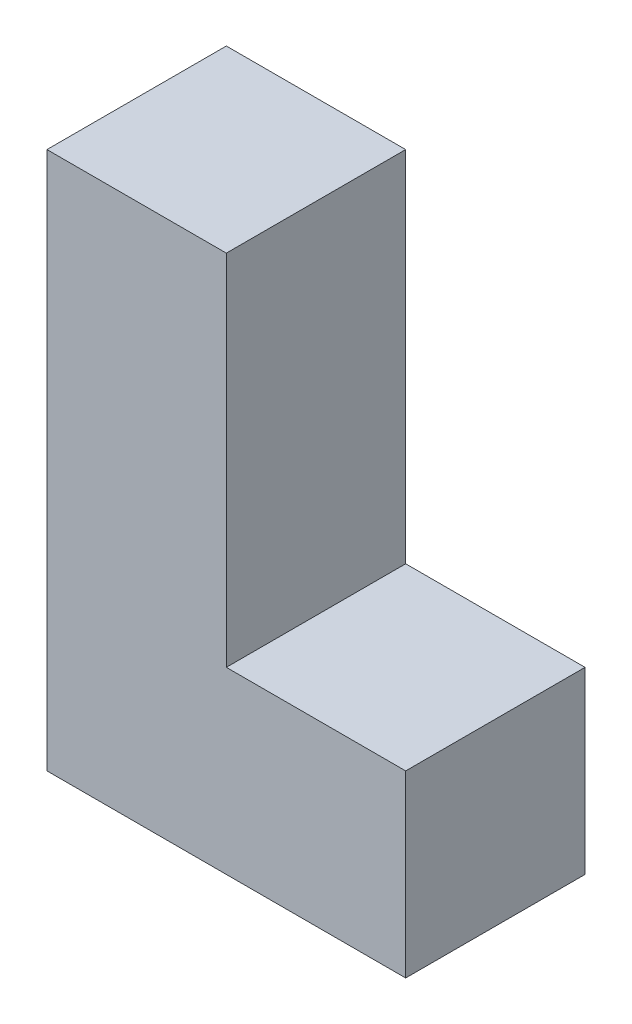
ISO-10303-21;
HEADER;
FILE_DESCRIPTION(('STEP AP214'),'2;1');
FILE_NAME('part.step','',(''),(''),'','','');
FILE_SCHEMA(('AUTOMOTIVE_DESIGN { 1 0 10303 214 1 1 1 1 }'));
ENDSEC;
DATA;
#1=APPLICATION_CONTEXT('core data for automotive mechanical design processes');
#2=APPLICATION_PROTOCOL_DEFINITION('international standard','automotive_design',2000,#1);
#3=PRODUCT_CONTEXT('',#1,'mechanical');
#4=PRODUCT('Part','Part','',(#3));
#5=PRODUCT_RELATED_PRODUCT_CATEGORY('part','',(#4));
#6=PRODUCT_DEFINITION_FORMATION('','',#4);
#7=PRODUCT_DEFINITION_CONTEXT('part definition',#1,'design');
#8=PRODUCT_DEFINITION('design','',#6,#7);
#9=PRODUCT_DEFINITION_SHAPE('','',#8);
#10=(LENGTH_UNIT() NAMED_UNIT(*) SI_UNIT(.MILLI.,.METRE.));
#11=(NAMED_UNIT(*) PLANE_ANGLE_UNIT() SI_UNIT($,.RADIAN.));
#12=(NAMED_UNIT(*) SI_UNIT($,.STERADIAN.) SOLID_ANGLE_UNIT());
#13=UNCERTAINTY_MEASURE_WITH_UNIT(LENGTH_MEASURE(1.E-05),#10,'distance_accuracy_value','');
#14=(GEOMETRIC_REPRESENTATION_CONTEXT(3) GLOBAL_UNCERTAINTY_ASSIGNED_CONTEXT((#13)) GLOBAL_UNIT_ASSIGNED_CONTEXT((#10,
#11,#12)) REPRESENTATION_CONTEXT('',''));
#15=CARTESIAN_POINT('',(0.,0.,0.));
#16=DIRECTION('',(0.,0.,1.));
#17=DIRECTION('',(1.,0.,0.));
#18=AXIS2_PLACEMENT_3D('',#15,#16,#17);
#19=CARTESIAN_POINT('',(0.,0.,-10.));
#20=DIRECTION('',(0.,-1.,0.));
#21=DIRECTION('',(0.,0.,-1.));
#22=AXIS2_PLACEMENT_3D('',#19,#20,#21);
#23=PLANE('',#22);
#24=DIRECTION('',(1.,0.,0.));
#25=VECTOR('',#24,1.);
#26=CARTESIAN_POINT('',(0.,0.,0.));
#27=LINE('',#26,#25);
#28=CARTESIAN_POINT('',(0.,0.,0.));
#29=VERTEX_POINT('',#28);
#30=CARTESIAN_POINT('',(20.,0.,0.));
#31=VERTEX_POINT('',#30);
#32=EDGE_CURVE('E117',#29,#31,#27,.T.);
#33=ORIENTED_EDGE('',*,*,#32,.F.);
#34=DIRECTION('',(0.,0.,1.));
#35=VECTOR('',#34,1.);
#36=CARTESIAN_POINT('',(0.,0.,-10.));
#37=LINE('',#36,#35);
#38=CARTESIAN_POINT('',(0.,0.,-10.));
#39=VERTEX_POINT('',#38);
#40=EDGE_CURVE('E11',#39,#29,#37,.T.);
#41=ORIENTED_EDGE('',*,*,#40,.F.);
#42=DIRECTION('',(1.,0.,0.));
#43=VECTOR('',#42,1.);
#44=CARTESIAN_POINT('',(0.,0.,-10.));
#45=LINE('',#44,#43);
#46=CARTESIAN_POINT('',(20.,0.,-10.));
#47=VERTEX_POINT('',#46);
#48=EDGE_CURVE('E131',#39,#47,#45,.T.);
#49=ORIENTED_EDGE('',*,*,#48,.T.);
#50=DIRECTION('',(0.,0.,1.));
#51=VECTOR('',#50,1.);
#52=CARTESIAN_POINT('',(20.,0.,-10.));
#53=LINE('',#52,#51);
#54=EDGE_CURVE('E35',#47,#31,#53,.T.);
#55=ORIENTED_EDGE('',*,*,#54,.T.);
#56=EDGE_LOOP('',(#33,#41,#49,#55));
#57=FACE_BOUND('',#56,.T.);
#58=ADVANCED_FACE('F32',(#57),#23,.T.);
#59=CARTESIAN_POINT('',(0.,0.,-10.));
#60=DIRECTION('',(-1.,0.,0.));
#61=DIRECTION('',(0.,-1.,0.));
#62=AXIS2_PLACEMENT_3D('',#59,#60,#61);
#63=PLANE('',#62);
#64=DIRECTION('',(0.,-1.,0.));
#65=VECTOR('',#64,1.);
#66=CARTESIAN_POINT('',(0.,0.,0.));
#67=LINE('',#66,#65);
#68=CARTESIAN_POINT('',(0.,30.,0.));
#69=VERTEX_POINT('',#68);
#70=EDGE_CURVE('E129',#69,#29,#67,.T.);
#71=ORIENTED_EDGE('',*,*,#70,.F.);
#72=DIRECTION('',(0.,0.,1.));
#73=VECTOR('',#72,1.);
#74=CARTESIAN_POINT('',(0.,30.,-10.));
#75=LINE('',#74,#73);
#76=CARTESIAN_POINT('',(0.,30.,-10.));
#77=VERTEX_POINT('',#76);
#78=EDGE_CURVE('E41',#77,#69,#75,.T.);
#79=ORIENTED_EDGE('',*,*,#78,.F.);
#80=DIRECTION('',(0.,-1.,0.));
#81=VECTOR('',#80,1.);
#82=CARTESIAN_POINT('',(0.,0.,-10.));
#83=LINE('',#82,#81);
#84=EDGE_CURVE('E107',#77,#39,#83,.T.);
#85=ORIENTED_EDGE('',*,*,#84,.T.);
#86=ORIENTED_EDGE('',*,*,#40,.T.);
#87=EDGE_LOOP('',(#71,#79,#85,#86));
#88=FACE_BOUND('',#87,.T.);
#89=ADVANCED_FACE('F139',(#88),#63,.T.);
#90=CARTESIAN_POINT('',(10.,30.,-10.));
#91=DIRECTION('',(0.,1.,0.));
#92=DIRECTION('',(0.,0.,1.));
#93=AXIS2_PLACEMENT_3D('',#90,#91,#92);
#94=PLANE('',#93);
#95=DIRECTION('',(-1.,0.,0.));
#96=VECTOR('',#95,1.);
#97=CARTESIAN_POINT('',(10.,30.,0.));
#98=LINE('',#97,#96);
#99=CARTESIAN_POINT('',(10.,30.,0.));
#100=VERTEX_POINT('',#99);
#101=EDGE_CURVE('E94',#100,#69,#98,.T.);
#102=ORIENTED_EDGE('',*,*,#101,.F.);
#103=DIRECTION('',(0.,0.,1.));
#104=VECTOR('',#103,1.);
#105=CARTESIAN_POINT('',(10.,30.,-10.));
#106=LINE('',#105,#104);
#107=CARTESIAN_POINT('',(10.,30.,-10.));
#108=VERTEX_POINT('',#107);
#109=EDGE_CURVE('E89',#108,#100,#106,.T.);
#110=ORIENTED_EDGE('',*,*,#109,.F.);
#111=DIRECTION('',(-1.,0.,0.));
#112=VECTOR('',#111,1.);
#113=CARTESIAN_POINT('',(10.,30.,-10.));
#114=LINE('',#113,#112);
#115=EDGE_CURVE('E92',#108,#77,#114,.T.);
#116=ORIENTED_EDGE('',*,*,#115,.T.);
#117=ORIENTED_EDGE('',*,*,#78,.T.);
#118=EDGE_LOOP('',(#102,#110,#116,#117));
#119=FACE_BOUND('',#118,.T.);
#120=ADVANCED_FACE('F91',(#119),#94,.T.);
#121=CARTESIAN_POINT('',(10.,30.,-10.));
#122=DIRECTION('',(1.,0.,0.));
#123=DIRECTION('',(0.,1.,0.));
#124=AXIS2_PLACEMENT_3D('',#121,#122,#123);
#125=PLANE('',#124);
#126=DIRECTION('',(0.,1.,0.));
#127=VECTOR('',#126,1.);
#128=CARTESIAN_POINT('',(10.,30.,0.));
#129=LINE('',#128,#127);
#130=CARTESIAN_POINT('',(10.,10.,0.));
#131=VERTEX_POINT('',#130);
#132=EDGE_CURVE('E126',#131,#100,#129,.T.);
#133=ORIENTED_EDGE('',*,*,#132,.F.);
#134=DIRECTION('',(0.,0.,1.));
#135=VECTOR('',#134,1.);
#136=CARTESIAN_POINT('',(10.,10.,-10.));
#137=LINE('',#136,#135);
#138=CARTESIAN_POINT('',(10.,10.,-10.));
#139=VERTEX_POINT('',#138);
#140=EDGE_CURVE('E99',#139,#131,#137,.T.);
#141=ORIENTED_EDGE('',*,*,#140,.F.);
#142=DIRECTION('',(0.,1.,0.));
#143=VECTOR('',#142,1.);
#144=CARTESIAN_POINT('',(10.,30.,-10.));
#145=LINE('',#144,#143);
#146=EDGE_CURVE('E105',#139,#108,#145,.T.);
#147=ORIENTED_EDGE('',*,*,#146,.T.);
#148=ORIENTED_EDGE('',*,*,#109,.T.);
#149=EDGE_LOOP('',(#133,#141,#147,#148));
#150=FACE_BOUND('',#149,.T.);
#151=ADVANCED_FACE('F109',(#150),#125,.T.);
#152=CARTESIAN_POINT('',(10.,10.,-10.));
#153=DIRECTION('',(0.,1.,0.));
#154=DIRECTION('',(0.,0.,1.));
#155=AXIS2_PLACEMENT_3D('',#152,#153,#154);
#156=PLANE('',#155);
#157=DIRECTION('',(-1.,0.,0.));
#158=VECTOR('',#157,1.);
#159=CARTESIAN_POINT('',(10.,10.,0.));
#160=LINE('',#159,#158);
#161=CARTESIAN_POINT('',(20.,10.,0.));
#162=VERTEX_POINT('',#161);
#163=EDGE_CURVE('E123',#162,#131,#160,.T.);
#164=ORIENTED_EDGE('',*,*,#163,.F.);
#165=DIRECTION('',(0.,0.,1.));
#166=VECTOR('',#165,1.);
#167=CARTESIAN_POINT('',(20.,10.,-10.));
#168=LINE('',#167,#166);
#169=CARTESIAN_POINT('',(20.,10.,-10.));
#170=VERTEX_POINT('',#169);
#171=EDGE_CURVE('E134',#170,#162,#168,.T.);
#172=ORIENTED_EDGE('',*,*,#171,.F.);
#173=DIRECTION('',(-1.,0.,0.));
#174=VECTOR('',#173,1.);
#175=CARTESIAN_POINT('',(10.,10.,-10.));
#176=LINE('',#175,#174);
#177=EDGE_CURVE('E110',#170,#139,#176,.T.);
#178=ORIENTED_EDGE('',*,*,#177,.T.);
#179=ORIENTED_EDGE('',*,*,#140,.T.);
#180=EDGE_LOOP('',(#164,#172,#178,#179));
#181=FACE_BOUND('',#180,.T.);
#182=ADVANCED_FACE('F152',(#181),#156,.T.);
#183=CARTESIAN_POINT('',(20.,10.,-10.));
#184=DIRECTION('',(1.,0.,0.));
#185=DIRECTION('',(0.,0.,-1.));
#186=AXIS2_PLACEMENT_3D('',#183,#184,#185);
#187=PLANE('',#186);
#188=DIRECTION('',(0.,1.,0.));
#189=VECTOR('',#188,1.);
#190=CARTESIAN_POINT('',(20.,10.,0.));
#191=LINE('',#190,#189);
#192=EDGE_CURVE('E120',#31,#162,#191,.T.);
#193=ORIENTED_EDGE('',*,*,#192,.F.);
#194=ORIENTED_EDGE('',*,*,#54,.F.);
#195=DIRECTION('',(0.,1.,0.));
#196=VECTOR('',#195,1.);
#197=CARTESIAN_POINT('',(20.,10.,-10.));
#198=LINE('',#197,#196);
#199=EDGE_CURVE('E112',#47,#170,#198,.T.);
#200=ORIENTED_EDGE('',*,*,#199,.T.);
#201=ORIENTED_EDGE('',*,*,#171,.T.);
#202=EDGE_LOOP('',(#193,#194,#200,#201));
#203=FACE_BOUND('',#202,.T.);
#204=ADVANCED_FACE('F136',(#203),#187,.T.);
#205=CARTESIAN_POINT('',(0.,0.,-10.));
#206=DIRECTION('',(0.,0.,-1.));
#207=DIRECTION('',(-1.,0.,0.));
#208=AXIS2_PLACEMENT_3D('',#205,#206,#207);
#209=PLANE('',#208);
#210=ORIENTED_EDGE('',*,*,#48,.F.);
#211=ORIENTED_EDGE('',*,*,#84,.F.);
#212=ORIENTED_EDGE('',*,*,#115,.F.);
#213=ORIENTED_EDGE('',*,*,#146,.F.);
#214=ORIENTED_EDGE('',*,*,#177,.F.);
#215=ORIENTED_EDGE('',*,*,#199,.F.);
#216=EDGE_LOOP('',(#210,#211,#212,#213,#214,#215));
#217=FACE_BOUND('',#216,.T.);
#218=ADVANCED_FACE('F103',(#217),#209,.T.);
#219=CARTESIAN_POINT('',(0.,0.,0.));
#220=DIRECTION('',(0.,0.,-1.));
#221=DIRECTION('',(-1.,0.,0.));
#222=AXIS2_PLACEMENT_3D('',#219,#220,#221);
#223=PLANE('',#222);
#224=ORIENTED_EDGE('',*,*,#32,.T.);
#225=ORIENTED_EDGE('',*,*,#192,.T.);
#226=ORIENTED_EDGE('',*,*,#163,.T.);
#227=ORIENTED_EDGE('',*,*,#132,.T.);
#228=ORIENTED_EDGE('',*,*,#101,.T.);
#229=ORIENTED_EDGE('',*,*,#70,.T.);
#230=EDGE_LOOP('',(#224,#225,#226,#227,#228,#229));
#231=FACE_BOUND('',#230,.T.);
#232=ADVANCED_FACE('F138',(#231),#223,.F.);
#233=CLOSED_SHELL('',(#58,#89,#120,#151,#182,#204,#218,#232));
#234=MANIFOLD_SOLID_BREP('B2',#233);
#235=ADVANCED_BREP_SHAPE_REPRESENTATION('',(#18,#234),#14);
#236=SHAPE_DEFINITION_REPRESENTATION(#9,#235);
ENDSEC;
END-ISO-10303-21;
